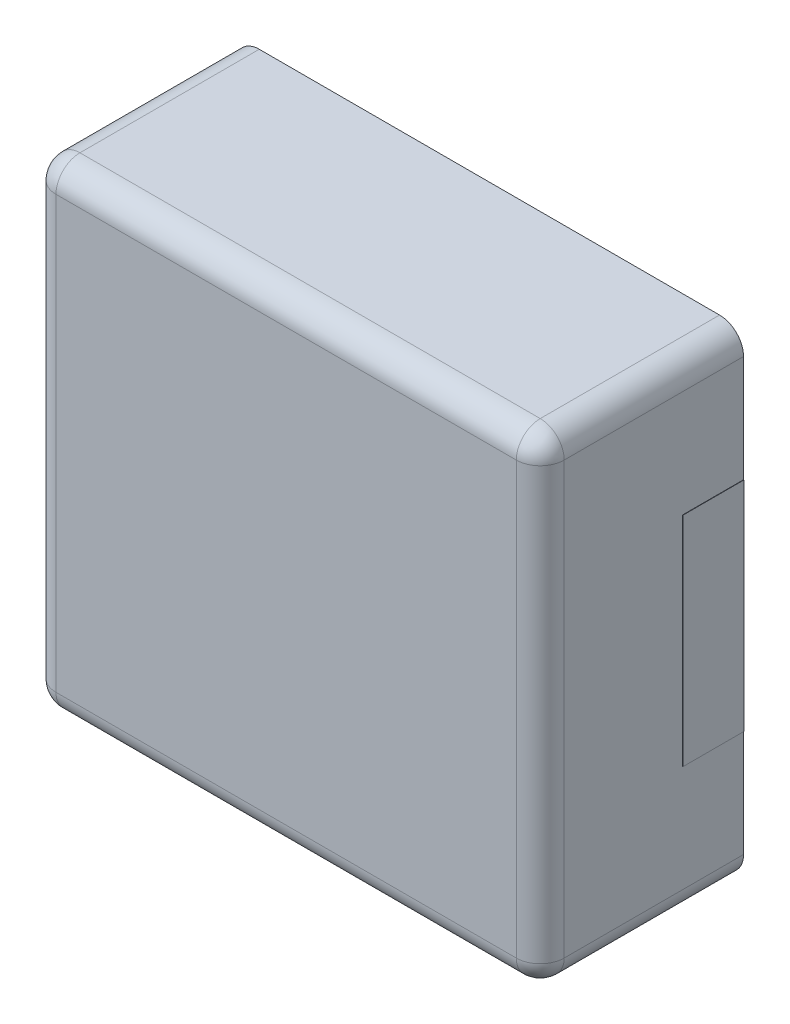
ISO-10303-21;
HEADER;
FILE_DESCRIPTION(('STEP AP214'),'2;1');
FILE_NAME('part.step','',(''),(''),'','','');
FILE_SCHEMA(('AUTOMOTIVE_DESIGN { 1 0 10303 214 1 1 1 1 }'));
ENDSEC;
DATA;
#1=APPLICATION_CONTEXT('core data for automotive mechanical design processes');
#2=APPLICATION_PROTOCOL_DEFINITION('international standard','automotive_design',2000,#1);
#3=PRODUCT_CONTEXT('',#1,'mechanical');
#4=PRODUCT('Part','Part','',(#3));
#5=PRODUCT_RELATED_PRODUCT_CATEGORY('part','',(#4));
#6=PRODUCT_DEFINITION_FORMATION('','',#4);
#7=PRODUCT_DEFINITION_CONTEXT('part definition',#1,'design');
#8=PRODUCT_DEFINITION('design','',#6,#7);
#9=PRODUCT_DEFINITION_SHAPE('','',#8);
#10=(LENGTH_UNIT() NAMED_UNIT(*) SI_UNIT(.MILLI.,.METRE.));
#11=(NAMED_UNIT(*) PLANE_ANGLE_UNIT() SI_UNIT($,.RADIAN.));
#12=(NAMED_UNIT(*) SI_UNIT($,.STERADIAN.) SOLID_ANGLE_UNIT());
#13=UNCERTAINTY_MEASURE_WITH_UNIT(LENGTH_MEASURE(1.E-05),#10,'distance_accuracy_value','');
#14=(GEOMETRIC_REPRESENTATION_CONTEXT(3) GLOBAL_UNCERTAINTY_ASSIGNED_CONTEXT((#13)) GLOBAL_UNIT_ASSIGNED_CONTEXT((#10,
#11,#12)) REPRESENTATION_CONTEXT('',''));
#15=CARTESIAN_POINT('',(0.,0.,0.));
#16=DIRECTION('',(0.,0.,1.));
#17=DIRECTION('',(1.,0.,0.));
#18=AXIS2_PLACEMENT_3D('',#15,#16,#17);
#19=CARTESIAN_POINT('',(3.17,-2.97,2.47));
#20=DIRECTION('',(0.,0.,-1.));
#21=DIRECTION('',(0.,-1.,0.));
#22=AXIS2_PLACEMENT_3D('',#19,#20,#21);
#23=SPHERICAL_SURFACE('',#22,0.33);
#24=CARTESIAN_POINT('',(3.17,-2.97,2.47));
#25=DIRECTION('',(0.,0.,1.));
#26=DIRECTION('',(0.,-1.,0.));
#27=AXIS2_PLACEMENT_3D('',#24,#25,#26);
#28=CIRCLE('',#27,0.33);
#29=CARTESIAN_POINT('',(3.17,-3.3,2.47));
#30=VERTEX_POINT('',#29);
#31=CARTESIAN_POINT('',(3.5,-2.97,2.47));
#32=VERTEX_POINT('',#31);
#33=EDGE_CURVE('P0_E234',#30,#32,#28,.T.);
#34=ORIENTED_EDGE('',*,*,#33,.T.);
#35=CARTESIAN_POINT('',(3.17,-2.97,2.47));
#36=DIRECTION('',(0.,1.,0.));
#37=DIRECTION('',(1.,0.,0.));
#38=AXIS2_PLACEMENT_3D('',#35,#36,#37);
#39=CIRCLE('',#38,0.33);
#40=CARTESIAN_POINT('',(3.17,-2.97,2.8));
#41=VERTEX_POINT('',#40);
#42=EDGE_CURVE('P0_E25',#41,#32,#39,.T.);
#43=ORIENTED_EDGE('',*,*,#42,.F.);
#44=CARTESIAN_POINT('',(3.17,-2.97,2.47));
#45=DIRECTION('',(1.,0.,0.));
#46=DIRECTION('',(0.,0.,1.));
#47=AXIS2_PLACEMENT_3D('',#44,#45,#46);
#48=CIRCLE('',#47,0.33);
#49=EDGE_CURVE('P0_E37',#41,#30,#48,.T.);
#50=ORIENTED_EDGE('',*,*,#49,.T.);
#51=EDGE_LOOP('',(#34,#43,#50));
#52=FACE_BOUND('',#51,.T.);
#53=ADVANCED_FACE('P0_F17',(#52),#23,.T.);
#54=CARTESIAN_POINT('',(1.895,-1.5,0.84));
#55=DIRECTION('',(0.,0.,1.));
#56=DIRECTION('',(1.,0.,0.));
#57=AXIS2_PLACEMENT_3D('',#54,#55,#56);
#58=PLANE('',#57);
#59=DIRECTION('',(0.,-1.,0.));
#60=VECTOR('',#59,1.);
#61=CARTESIAN_POINT('',(3.5,-2.4,0.84));
#62=LINE('',#61,#60);
#63=CARTESIAN_POINT('',(3.5,1.5,0.84));
#64=VERTEX_POINT('',#63);
#65=CARTESIAN_POINT('',(3.5,-1.5,0.84));
#66=VERTEX_POINT('',#65);
#67=EDGE_CURVE('P0_E254',#64,#66,#62,.T.);
#68=ORIENTED_EDGE('',*,*,#67,.T.);
#69=DIRECTION('',(1.,0.,0.));
#70=VECTOR('',#69,1.);
#71=CARTESIAN_POINT('',(1.895,-1.5,0.84));
#72=LINE('',#71,#70);
#73=CARTESIAN_POINT('',(1.895,-1.5,0.84));
#74=VERTEX_POINT('',#73);
#75=EDGE_CURVE('P0_E47',#74,#66,#72,.T.);
#76=ORIENTED_EDGE('',*,*,#75,.F.);
#77=DIRECTION('',(0.,1.,0.));
#78=VECTOR('',#77,1.);
#79=CARTESIAN_POINT('',(1.895,-1.5,0.84));
#80=LINE('',#79,#78);
#81=CARTESIAN_POINT('',(1.895,1.5,0.84));
#82=VERTEX_POINT('',#81);
#83=EDGE_CURVE('P0_E376',#74,#82,#80,.T.);
#84=ORIENTED_EDGE('',*,*,#83,.T.);
#85=DIRECTION('',(1.,0.,0.));
#86=VECTOR('',#85,1.);
#87=CARTESIAN_POINT('',(1.895,1.5,0.84));
#88=LINE('',#87,#86);
#89=EDGE_CURVE('P0_E395',#82,#64,#88,.T.);
#90=ORIENTED_EDGE('',*,*,#89,.T.);
#91=EDGE_LOOP('',(#68,#76,#84,#90));
#92=FACE_BOUND('',#91,.T.);
#93=ADVANCED_FACE('P0_F601',(#92),#58,.F.);
#94=CARTESIAN_POINT('',(3.17,2.97,2.47));
#95=DIRECTION('',(0.,0.,-1.));
#96=DIRECTION('',(1.,0.,0.));
#97=AXIS2_PLACEMENT_3D('',#94,#95,#96);
#98=SPHERICAL_SURFACE('',#97,0.33);
#99=CARTESIAN_POINT('',(3.17,2.97,2.47));
#100=DIRECTION('',(0.,0.,1.));
#101=DIRECTION('',(1.,0.,0.));
#102=AXIS2_PLACEMENT_3D('',#99,#100,#101);
#103=CIRCLE('',#102,0.33);
#104=CARTESIAN_POINT('',(3.5,2.97,2.47));
#105=VERTEX_POINT('',#104);
#106=CARTESIAN_POINT('',(3.17,3.3,2.47));
#107=VERTEX_POINT('',#106);
#108=EDGE_CURVE('P0_E329',#105,#107,#103,.T.);
#109=ORIENTED_EDGE('',*,*,#108,.T.);
#110=CARTESIAN_POINT('',(3.17,2.97,2.47));
#111=DIRECTION('',(-1.,0.,0.));
#112=DIRECTION('',(0.,1.,0.));
#113=AXIS2_PLACEMENT_3D('',#110,#111,#112);
#114=CIRCLE('',#113,0.33);
#115=CARTESIAN_POINT('',(3.17,2.97,2.8));
#116=VERTEX_POINT('',#115);
#117=EDGE_CURVE('P0_E409',#116,#107,#114,.T.);
#118=ORIENTED_EDGE('',*,*,#117,.F.);
#119=CARTESIAN_POINT('',(3.17,2.97,2.47));
#120=DIRECTION('',(0.,1.,0.));
#121=DIRECTION('',(0.,0.,1.));
#122=AXIS2_PLACEMENT_3D('',#119,#120,#121);
#123=CIRCLE('',#122,0.33);
#124=EDGE_CURVE('P0_E11',#116,#105,#123,.T.);
#125=ORIENTED_EDGE('',*,*,#124,.T.);
#126=EDGE_LOOP('',(#109,#118,#125));
#127=FACE_BOUND('',#126,.T.);
#128=ADVANCED_FACE('P0_F617',(#127),#98,.T.);
#129=CARTESIAN_POINT('',(3.17,-2.97,2.47));
#130=DIRECTION('',(0.,1.,0.));
#131=DIRECTION('',(0.,0.,1.));
#132=AXIS2_PLACEMENT_3D('',#129,#130,#131);
#133=CYLINDRICAL_SURFACE('',#132,0.33);
#134=ORIENTED_EDGE('',*,*,#42,.T.);
#135=DIRECTION('',(0.,1.,0.));
#136=VECTOR('',#135,1.);
#137=CARTESIAN_POINT('',(3.5,-2.97,2.47));
#138=LINE('',#137,#136);
#139=EDGE_CURVE('P0_E269',#32,#105,#138,.T.);
#140=ORIENTED_EDGE('',*,*,#139,.T.);
#141=ORIENTED_EDGE('',*,*,#124,.F.);
#142=DIRECTION('',(0.,1.,0.));
#143=VECTOR('',#142,1.);
#144=CARTESIAN_POINT('',(3.17,-2.97,2.8));
#145=LINE('',#144,#143);
#146=EDGE_CURVE('P0_E366',#41,#116,#145,.T.);
#147=ORIENTED_EDGE('',*,*,#146,.F.);
#148=EDGE_LOOP('',(#134,#140,#141,#147));
#149=FACE_BOUND('',#148,.T.);
#150=ADVANCED_FACE('P0_F621',(#149),#133,.T.);
#151=CARTESIAN_POINT('',(-3.17,-2.97,2.47));
#152=DIRECTION('',(1.,0.,0.));
#153=DIRECTION('',(0.,0.,1.));
#154=AXIS2_PLACEMENT_3D('',#151,#152,#153);
#155=CYLINDRICAL_SURFACE('',#154,0.33);
#156=CARTESIAN_POINT('',(-3.17,-2.97,2.47));
#157=DIRECTION('',(1.,0.,0.));
#158=DIRECTION('',(0.,-1.,0.));
#159=AXIS2_PLACEMENT_3D('',#156,#157,#158);
#160=CIRCLE('',#159,0.33);
#161=CARTESIAN_POINT('',(-3.17,-2.97,2.8));
#162=VERTEX_POINT('',#161);
#163=CARTESIAN_POINT('',(-3.17,-3.3,2.47));
#164=VERTEX_POINT('',#163);
#165=EDGE_CURVE('P0_E284',#162,#164,#160,.T.);
#166=ORIENTED_EDGE('',*,*,#165,.T.);
#167=DIRECTION('',(1.,0.,0.));
#168=VECTOR('',#167,1.);
#169=CARTESIAN_POINT('',(-3.17,-3.3,2.47));
#170=LINE('',#169,#168);
#171=EDGE_CURVE('P0_E406',#164,#30,#170,.T.);
#172=ORIENTED_EDGE('',*,*,#171,.T.);
#173=ORIENTED_EDGE('',*,*,#49,.F.);
#174=DIRECTION('',(1.,0.,0.));
#175=VECTOR('',#174,1.);
#176=CARTESIAN_POINT('',(-3.17,-2.97,2.8));
#177=LINE('',#176,#175);
#178=EDGE_CURVE('P0_E362',#162,#41,#177,.T.);
#179=ORIENTED_EDGE('',*,*,#178,.F.);
#180=EDGE_LOOP('',(#166,#172,#173,#179));
#181=FACE_BOUND('',#180,.T.);
#182=ADVANCED_FACE('P0_F666',(#181),#155,.T.);
#183=CARTESIAN_POINT('',(3.17,2.97,2.47));
#184=DIRECTION('',(-1.,0.,0.));
#185=DIRECTION('',(0.,0.,1.));
#186=AXIS2_PLACEMENT_3D('',#183,#184,#185);
#187=CYLINDRICAL_SURFACE('',#186,0.33);
#188=ORIENTED_EDGE('',*,*,#117,.T.);
#189=DIRECTION('',(-1.,0.,0.));
#190=VECTOR('',#189,1.);
#191=CARTESIAN_POINT('',(3.17,3.3,2.47));
#192=LINE('',#191,#190);
#193=CARTESIAN_POINT('',(-3.17,3.3,2.47));
#194=VERTEX_POINT('',#193);
#195=EDGE_CURVE('P0_E280',#107,#194,#192,.T.);
#196=ORIENTED_EDGE('',*,*,#195,.T.);
#197=CARTESIAN_POINT('',(-3.17,2.97,2.47));
#198=DIRECTION('',(-1.,0.,0.));
#199=DIRECTION('',(0.,0.,1.));
#200=AXIS2_PLACEMENT_3D('',#197,#198,#199);
#201=CIRCLE('',#200,0.33);
#202=CARTESIAN_POINT('',(-3.17,2.97,2.8));
#203=VERTEX_POINT('',#202);
#204=EDGE_CURVE('P0_E358',#203,#194,#201,.T.);
#205=ORIENTED_EDGE('',*,*,#204,.F.);
#206=DIRECTION('',(-1.,0.,0.));
#207=VECTOR('',#206,1.);
#208=CARTESIAN_POINT('',(3.17,2.97,2.8));
#209=LINE('',#208,#207);
#210=EDGE_CURVE('P0_E370',#116,#203,#209,.T.);
#211=ORIENTED_EDGE('',*,*,#210,.F.);
#212=EDGE_LOOP('',(#188,#196,#205,#211));
#213=FACE_BOUND('',#212,.T.);
#214=ADVANCED_FACE('P0_F667',(#213),#187,.T.);
#215=CARTESIAN_POINT('',(-3.5,-3.3,0.));
#216=DIRECTION('',(0.,1.,0.));
#217=DIRECTION('',(1.,0.,0.));
#218=AXIS2_PLACEMENT_3D('',#215,#216,#217);
#219=PLANE('',#218);
#220=DIRECTION('',(1.,0.,0.));
#221=VECTOR('',#220,1.);
#222=CARTESIAN_POINT('',(-3.5,-3.3,0.));
#223=LINE('',#222,#221);
#224=CARTESIAN_POINT('',(-3.17,-3.3,0.));
#225=VERTEX_POINT('',#224);
#226=CARTESIAN_POINT('',(3.17,-3.3,0.));
#227=VERTEX_POINT('',#226);
#228=EDGE_CURVE('P0_E324',#225,#227,#223,.T.);
#229=ORIENTED_EDGE('',*,*,#228,.T.);
#230=DIRECTION('',(0.,0.,1.));
#231=VECTOR('',#230,1.);
#232=CARTESIAN_POINT('',(3.17,-3.3,0.));
#233=LINE('',#232,#231);
#234=EDGE_CURVE('P0_E237',#227,#30,#233,.T.);
#235=ORIENTED_EDGE('',*,*,#234,.T.);
#236=ORIENTED_EDGE('',*,*,#171,.F.);
#237=DIRECTION('',(0.,0.,1.));
#238=VECTOR('',#237,1.);
#239=CARTESIAN_POINT('',(-3.17,-3.3,0.));
#240=LINE('',#239,#238);
#241=EDGE_CURVE('P0_E350',#225,#164,#240,.T.);
#242=ORIENTED_EDGE('',*,*,#241,.F.);
#243=EDGE_LOOP('',(#229,#235,#236,#242));
#244=FACE_BOUND('',#243,.T.);
#245=ADVANCED_FACE('P0_F629',(#244),#219,.F.);
#246=CARTESIAN_POINT('',(3.17,-2.97,0.));
#247=DIRECTION('',(0.,0.,1.));
#248=DIRECTION('',(1.,0.,0.));
#249=AXIS2_PLACEMENT_3D('',#246,#247,#248);
#250=CYLINDRICAL_SURFACE('',#249,0.33);
#251=ORIENTED_EDGE('',*,*,#33,.F.);
#252=ORIENTED_EDGE('',*,*,#234,.F.);
#253=CARTESIAN_POINT('',(3.17,-2.97,0.));
#254=DIRECTION('',(0.,0.,-1.));
#255=DIRECTION('',(0.,-1.,0.));
#256=AXIS2_PLACEMENT_3D('',#253,#254,#255);
#257=CIRCLE('',#256,0.33);
#258=CARTESIAN_POINT('',(3.5,-2.97,0.));
#259=VERTEX_POINT('',#258);
#260=EDGE_CURVE('P0_E320',#259,#227,#257,.T.);
#261=ORIENTED_EDGE('',*,*,#260,.F.);
#262=DIRECTION('',(0.,0.,1.));
#263=VECTOR('',#262,1.);
#264=CARTESIAN_POINT('',(3.5,-2.97,0.));
#265=LINE('',#264,#263);
#266=EDGE_CURVE('P0_E265',#259,#32,#265,.T.);
#267=ORIENTED_EDGE('',*,*,#266,.T.);
#268=EDGE_LOOP('',(#251,#252,#261,#267));
#269=FACE_BOUND('',#268,.T.);
#270=ADVANCED_FACE('P0_F625',(#269),#250,.T.);
#271=CARTESIAN_POINT('',(1.895,-1.5,0.));
#272=DIRECTION('',(0.,1.,0.));
#273=DIRECTION('',(1.,0.,0.));
#274=AXIS2_PLACEMENT_3D('',#271,#272,#273);
#275=PLANE('',#274);
#276=DIRECTION('',(1.,0.,0.));
#277=VECTOR('',#276,1.);
#278=CARTESIAN_POINT('',(1.895,-1.5,0.));
#279=LINE('',#278,#277);
#280=CARTESIAN_POINT('',(1.895,-1.5,0.));
#281=VERTEX_POINT('',#280);
#282=CARTESIAN_POINT('',(3.5,-1.5,0.));
#283=VERTEX_POINT('',#282);
#284=EDGE_CURVE('P0_E238',#281,#283,#279,.T.);
#285=ORIENTED_EDGE('',*,*,#284,.F.);
#286=DIRECTION('',(0.,0.,1.));
#287=VECTOR('',#286,1.);
#288=CARTESIAN_POINT('',(1.895,-1.5,0.));
#289=LINE('',#288,#287);
#290=EDGE_CURVE('P0_E379',#281,#74,#289,.T.);
#291=ORIENTED_EDGE('',*,*,#290,.T.);
#292=ORIENTED_EDGE('',*,*,#75,.T.);
#293=DIRECTION('',(0.,0.,1.));
#294=VECTOR('',#293,1.);
#295=CARTESIAN_POINT('',(3.5,-1.5,0.));
#296=LINE('',#295,#294);
#297=EDGE_CURVE('P0_E258',#283,#66,#296,.T.);
#298=ORIENTED_EDGE('',*,*,#297,.F.);
#299=EDGE_LOOP('',(#285,#291,#292,#298));
#300=FACE_BOUND('',#299,.T.);
#301=ADVANCED_FACE('P0_F608',(#300),#275,.T.);
#302=CARTESIAN_POINT('',(1.895,-1.5,0.));
#303=DIRECTION('',(1.,0.,0.));
#304=DIRECTION('',(0.,1.,0.));
#305=AXIS2_PLACEMENT_3D('',#302,#303,#304);
#306=PLANE('',#305);
#307=ORIENTED_EDGE('',*,*,#290,.F.);
#308=DIRECTION('',(0.,1.,0.));
#309=VECTOR('',#308,1.);
#310=CARTESIAN_POINT('',(1.895,-1.5,0.));
#311=LINE('',#310,#309);
#312=CARTESIAN_POINT('',(1.895,1.5,0.));
#313=VERTEX_POINT('',#312);
#314=EDGE_CURVE('P0_E243',#281,#313,#311,.T.);
#315=ORIENTED_EDGE('',*,*,#314,.T.);
#316=DIRECTION('',(0.,0.,1.));
#317=VECTOR('',#316,1.);
#318=CARTESIAN_POINT('',(1.895,1.5,0.));
#319=LINE('',#318,#317);
#320=EDGE_CURVE('P0_E223',#313,#82,#319,.T.);
#321=ORIENTED_EDGE('',*,*,#320,.T.);
#322=ORIENTED_EDGE('',*,*,#83,.F.);
#323=EDGE_LOOP('',(#307,#315,#321,#322));
#324=FACE_BOUND('',#323,.T.);
#325=ADVANCED_FACE('P0_F595',(#324),#306,.T.);
#326=CARTESIAN_POINT('',(1.895,1.5,0.));
#327=DIRECTION('',(0.,1.,0.));
#328=DIRECTION('',(1.,0.,0.));
#329=AXIS2_PLACEMENT_3D('',#326,#327,#328);
#330=PLANE('',#329);
#331=DIRECTION('',(0.,0.,1.));
#332=VECTOR('',#331,1.);
#333=CARTESIAN_POINT('',(3.5,1.5,0.));
#334=LINE('',#333,#332);
#335=CARTESIAN_POINT('',(3.5,1.5,0.));
#336=VERTEX_POINT('',#335);
#337=EDGE_CURVE('P0_E257',#336,#64,#334,.T.);
#338=ORIENTED_EDGE('',*,*,#337,.T.);
#339=ORIENTED_EDGE('',*,*,#89,.F.);
#340=ORIENTED_EDGE('',*,*,#320,.F.);
#341=DIRECTION('',(1.,0.,0.));
#342=VECTOR('',#341,1.);
#343=CARTESIAN_POINT('',(1.895,1.5,0.));
#344=LINE('',#343,#342);
#345=EDGE_CURVE('P0_E305',#313,#336,#344,.T.);
#346=ORIENTED_EDGE('',*,*,#345,.T.);
#347=EDGE_LOOP('',(#338,#339,#340,#346));
#348=FACE_BOUND('',#347,.T.);
#349=ADVANCED_FACE('P0_F599',(#348),#330,.F.);
#350=CARTESIAN_POINT('',(3.5,-3.3,0.));
#351=DIRECTION('',(1.,0.,0.));
#352=DIRECTION('',(0.,1.,0.));
#353=AXIS2_PLACEMENT_3D('',#350,#351,#352);
#354=PLANE('',#353);
#355=ORIENTED_EDGE('',*,*,#139,.F.);
#356=ORIENTED_EDGE('',*,*,#266,.F.);
#357=DIRECTION('',(0.,1.,0.));
#358=VECTOR('',#357,1.);
#359=CARTESIAN_POINT('',(3.5,-3.3,0.));
#360=LINE('',#359,#358);
#361=EDGE_CURVE('P0_E242',#259,#283,#360,.T.);
#362=ORIENTED_EDGE('',*,*,#361,.T.);
#363=ORIENTED_EDGE('',*,*,#297,.T.);
#364=ORIENTED_EDGE('',*,*,#67,.F.);
#365=ORIENTED_EDGE('',*,*,#337,.F.);
#366=DIRECTION('',(0.,1.,0.));
#367=VECTOR('',#366,1.);
#368=CARTESIAN_POINT('',(3.5,-3.3,0.));
#369=LINE('',#368,#367);
#370=CARTESIAN_POINT('',(3.5,2.97,0.));
#371=VERTEX_POINT('',#370);
#372=EDGE_CURVE('P0_E301',#336,#371,#369,.T.);
#373=ORIENTED_EDGE('',*,*,#372,.T.);
#374=DIRECTION('',(0.,0.,1.));
#375=VECTOR('',#374,1.);
#376=CARTESIAN_POINT('',(3.5,2.97,0.));
#377=LINE('',#376,#375);
#378=EDGE_CURVE('P0_E325',#371,#105,#377,.T.);
#379=ORIENTED_EDGE('',*,*,#378,.T.);
#380=EDGE_LOOP('',(#355,#356,#362,#363,#364,#365,#373,#379));
#381=FACE_BOUND('',#380,.T.);
#382=ADVANCED_FACE('P0_F604',(#381),#354,.T.);
#383=CARTESIAN_POINT('',(3.17,2.97,0.));
#384=DIRECTION('',(0.,0.,1.));
#385=DIRECTION('',(1.,0.,0.));
#386=AXIS2_PLACEMENT_3D('',#383,#384,#385);
#387=CYLINDRICAL_SURFACE('',#386,0.33);
#388=ORIENTED_EDGE('',*,*,#378,.F.);
#389=CARTESIAN_POINT('',(3.17,2.97,0.));
#390=DIRECTION('',(0.,0.,1.));
#391=DIRECTION('',(0.,-1.,0.));
#392=AXIS2_PLACEMENT_3D('',#389,#390,#391);
#393=CIRCLE('',#392,0.33);
#394=CARTESIAN_POINT('',(3.17,3.3,0.));
#395=VERTEX_POINT('',#394);
#396=EDGE_CURVE('P0_E297',#371,#395,#393,.T.);
#397=ORIENTED_EDGE('',*,*,#396,.T.);
#398=DIRECTION('',(0.,0.,1.));
#399=VECTOR('',#398,1.);
#400=CARTESIAN_POINT('',(3.17,3.3,0.));
#401=LINE('',#400,#399);
#402=EDGE_CURVE('P0_E283',#395,#107,#401,.T.);
#403=ORIENTED_EDGE('',*,*,#402,.T.);
#404=ORIENTED_EDGE('',*,*,#108,.F.);
#405=EDGE_LOOP('',(#388,#397,#403,#404));
#406=FACE_BOUND('',#405,.T.);
#407=ADVANCED_FACE('P0_F613',(#406),#387,.T.);
#408=CARTESIAN_POINT('',(-1.895,-1.5,0.));
#409=DIRECTION('',(1.,0.,0.));
#410=DIRECTION('',(0.,1.,0.));
#411=AXIS2_PLACEMENT_3D('',#408,#409,#410);
#412=PLANE('',#411);
#413=DIRECTION('',(0.,1.,0.));
#414=VECTOR('',#413,1.);
#415=CARTESIAN_POINT('',(-1.895,-1.5,0.84));
#416=LINE('',#415,#414);
#417=CARTESIAN_POINT('',(-1.895,-1.5,0.84));
#418=VERTEX_POINT('',#417);
#419=CARTESIAN_POINT('',(-1.895,1.5,0.84));
#420=VERTEX_POINT('',#419);
#421=EDGE_CURVE('P0_E306',#418,#420,#416,.T.);
#422=ORIENTED_EDGE('',*,*,#421,.T.);
#423=DIRECTION('',(0.,0.,1.));
#424=VECTOR('',#423,1.);
#425=CARTESIAN_POINT('',(-1.895,1.5,0.));
#426=LINE('',#425,#424);
#427=CARTESIAN_POINT('',(-1.895,1.5,0.));
#428=VERTEX_POINT('',#427);
#429=EDGE_CURVE('P0_E334',#428,#420,#426,.T.);
#430=ORIENTED_EDGE('',*,*,#429,.F.);
#431=DIRECTION('',(0.,1.,0.));
#432=VECTOR('',#431,1.);
#433=CARTESIAN_POINT('',(-1.895,-1.5,0.));
#434=LINE('',#433,#432);
#435=CARTESIAN_POINT('',(-1.895,-1.5,0.));
#436=VERTEX_POINT('',#435);
#437=EDGE_CURVE('P0_E287',#436,#428,#434,.T.);
#438=ORIENTED_EDGE('',*,*,#437,.F.);
#439=DIRECTION('',(0.,0.,1.));
#440=VECTOR('',#439,1.);
#441=CARTESIAN_POINT('',(-1.895,-1.5,0.));
#442=LINE('',#441,#440);
#443=EDGE_CURVE('P0_E347',#436,#418,#442,.T.);
#444=ORIENTED_EDGE('',*,*,#443,.T.);
#445=EDGE_LOOP('',(#422,#430,#438,#444));
#446=FACE_BOUND('',#445,.T.);
#447=ADVANCED_FACE('P0_F639',(#446),#412,.F.);
#448=CARTESIAN_POINT('',(-3.5,3.3,0.));
#449=DIRECTION('',(0.,1.,0.));
#450=DIRECTION('',(1.,0.,0.));
#451=AXIS2_PLACEMENT_3D('',#448,#449,#450);
#452=PLANE('',#451);
#453=DIRECTION('',(0.,0.,1.));
#454=VECTOR('',#453,1.);
#455=CARTESIAN_POINT('',(-3.17,3.3,0.));
#456=LINE('',#455,#454);
#457=CARTESIAN_POINT('',(-3.17,3.3,0.));
#458=VERTEX_POINT('',#457);
#459=EDGE_CURVE('P0_E192',#458,#194,#456,.T.);
#460=ORIENTED_EDGE('',*,*,#459,.T.);
#461=ORIENTED_EDGE('',*,*,#195,.F.);
#462=ORIENTED_EDGE('',*,*,#402,.F.);
#463=DIRECTION('',(1.,0.,0.));
#464=VECTOR('',#463,1.);
#465=CARTESIAN_POINT('',(-3.5,3.3,0.));
#466=LINE('',#465,#464);
#467=EDGE_CURVE('P0_E294',#458,#395,#466,.T.);
#468=ORIENTED_EDGE('',*,*,#467,.F.);
#469=EDGE_LOOP('',(#460,#461,#462,#468));
#470=FACE_BOUND('',#469,.T.);
#471=ADVANCED_FACE('P0_F683',(#470),#452,.T.);
#472=CARTESIAN_POINT('',(-3.17,-2.97,2.47));
#473=DIRECTION('',(0.,0.,-1.));
#474=DIRECTION('',(-1.,0.,0.));
#475=AXIS2_PLACEMENT_3D('',#472,#473,#474);
#476=SPHERICAL_SURFACE('',#475,0.33);
#477=CARTESIAN_POINT('',(-3.17,-2.97,2.47));
#478=DIRECTION('',(0.,0.,1.));
#479=DIRECTION('',(-1.,0.,0.));
#480=AXIS2_PLACEMENT_3D('',#477,#478,#479);
#481=CIRCLE('',#480,0.33);
#482=CARTESIAN_POINT('',(-3.5,-2.97,2.47));
#483=VERTEX_POINT('',#482);
#484=EDGE_CURVE('P0_E354',#483,#164,#481,.T.);
#485=ORIENTED_EDGE('',*,*,#484,.T.);
#486=ORIENTED_EDGE('',*,*,#165,.F.);
#487=CARTESIAN_POINT('',(-3.17,-2.97,2.47));
#488=DIRECTION('',(0.,-1.,0.));
#489=DIRECTION('',(-1.,0.,0.));
#490=AXIS2_PLACEMENT_3D('',#487,#488,#489);
#491=CIRCLE('',#490,0.33);
#492=EDGE_CURVE('P0_E228',#162,#483,#491,.T.);
#493=ORIENTED_EDGE('',*,*,#492,.T.);
#494=EDGE_LOOP('',(#485,#486,#493));
#495=FACE_BOUND('',#494,.T.);
#496=ADVANCED_FACE('P0_F686',(#495),#476,.T.);
#497=CARTESIAN_POINT('',(-3.5,-3.3,2.8));
#498=DIRECTION('',(0.,0.,1.));
#499=DIRECTION('',(1.,0.,0.));
#500=AXIS2_PLACEMENT_3D('',#497,#498,#499);
#501=PLANE('',#500);
#502=ORIENTED_EDGE('',*,*,#178,.T.);
#503=ORIENTED_EDGE('',*,*,#146,.T.);
#504=ORIENTED_EDGE('',*,*,#210,.T.);
#505=DIRECTION('',(0.,-1.,0.));
#506=VECTOR('',#505,1.);
#507=CARTESIAN_POINT('',(-3.17,2.97,2.8));
#508=LINE('',#507,#506);
#509=EDGE_CURVE('P0_E224',#203,#162,#508,.T.);
#510=ORIENTED_EDGE('',*,*,#509,.T.);
#511=EDGE_LOOP('',(#502,#503,#504,#510));
#512=FACE_BOUND('',#511,.T.);
#513=ADVANCED_FACE('P0_F690',(#512),#501,.T.);
#514=CARTESIAN_POINT('',(-3.17,2.97,2.47));
#515=DIRECTION('',(0.,0.,-1.));
#516=DIRECTION('',(0.,1.,0.));
#517=AXIS2_PLACEMENT_3D('',#514,#515,#516);
#518=SPHERICAL_SURFACE('',#517,0.33);
#519=CARTESIAN_POINT('',(-3.17,2.97,2.47));
#520=DIRECTION('',(0.,0.,1.));
#521=DIRECTION('',(0.,1.,0.));
#522=AXIS2_PLACEMENT_3D('',#519,#520,#521);
#523=CIRCLE('',#522,0.33);
#524=CARTESIAN_POINT('',(-3.5,2.97,2.47));
#525=VERTEX_POINT('',#524);
#526=EDGE_CURVE('P0_E227',#194,#525,#523,.T.);
#527=ORIENTED_EDGE('',*,*,#526,.T.);
#528=CARTESIAN_POINT('',(-3.17,2.97,2.47));
#529=DIRECTION('',(0.,-1.,0.));
#530=DIRECTION('',(-1.,0.,0.));
#531=AXIS2_PLACEMENT_3D('',#528,#529,#530);
#532=CIRCLE('',#531,0.33);
#533=EDGE_CURVE('P0_E264',#203,#525,#532,.T.);
#534=ORIENTED_EDGE('',*,*,#533,.F.);
#535=ORIENTED_EDGE('',*,*,#204,.T.);
#536=EDGE_LOOP('',(#527,#534,#535));
#537=FACE_BOUND('',#536,.T.);
#538=ADVANCED_FACE('P0_F694',(#537),#518,.T.);
#539=CARTESIAN_POINT('',(-3.17,-2.97,0.));
#540=DIRECTION('',(0.,0.,1.));
#541=DIRECTION('',(-1.,0.,0.));
#542=AXIS2_PLACEMENT_3D('',#539,#540,#541);
#543=CYLINDRICAL_SURFACE('',#542,0.33);
#544=DIRECTION('',(0.,0.,1.));
#545=VECTOR('',#544,1.);
#546=CARTESIAN_POINT('',(-3.5,-2.97,0.));
#547=LINE('',#546,#545);
#548=CARTESIAN_POINT('',(-3.5,-2.97,0.));
#549=VERTEX_POINT('',#548);
#550=EDGE_CURVE('P0_E230',#549,#483,#547,.T.);
#551=ORIENTED_EDGE('',*,*,#550,.F.);
#552=CARTESIAN_POINT('',(-3.17,-2.97,0.));
#553=DIRECTION('',(0.,0.,1.));
#554=DIRECTION('',(0.,-1.,0.));
#555=AXIS2_PLACEMENT_3D('',#552,#553,#554);
#556=CIRCLE('',#555,0.33);
#557=EDGE_CURVE('P0_E333',#549,#225,#556,.T.);
#558=ORIENTED_EDGE('',*,*,#557,.T.);
#559=ORIENTED_EDGE('',*,*,#241,.T.);
#560=ORIENTED_EDGE('',*,*,#484,.F.);
#561=EDGE_LOOP('',(#551,#558,#559,#560));
#562=FACE_BOUND('',#561,.T.);
#563=ADVANCED_FACE('P0_F631',(#562),#543,.T.);
#564=CARTESIAN_POINT('',(-3.505,-1.5,0.));
#565=DIRECTION('',(0.,1.,0.));
#566=DIRECTION('',(1.,0.,0.));
#567=AXIS2_PLACEMENT_3D('',#564,#565,#566);
#568=PLANE('',#567);
#569=DIRECTION('',(1.,0.,0.));
#570=VECTOR('',#569,1.);
#571=CARTESIAN_POINT('',(-3.505,-1.5,0.));
#572=LINE('',#571,#570);
#573=CARTESIAN_POINT('',(-3.5,-1.5,0.));
#574=VERTEX_POINT('',#573);
#575=EDGE_CURVE('P0_E196',#574,#436,#572,.T.);
#576=ORIENTED_EDGE('',*,*,#575,.F.);
#577=DIRECTION('',(0.,0.,1.));
#578=VECTOR('',#577,1.);
#579=CARTESIAN_POINT('',(-3.5,-1.5,0.));
#580=LINE('',#579,#578);
#581=CARTESIAN_POINT('',(-3.5,-1.5,0.84));
#582=VERTEX_POINT('',#581);
#583=EDGE_CURVE('P0_E250',#574,#582,#580,.T.);
#584=ORIENTED_EDGE('',*,*,#583,.T.);
#585=DIRECTION('',(1.,0.,0.));
#586=VECTOR('',#585,1.);
#587=CARTESIAN_POINT('',(-3.505,-1.5,0.84));
#588=LINE('',#587,#586);
#589=EDGE_CURVE('P0_E309',#582,#418,#588,.T.);
#590=ORIENTED_EDGE('',*,*,#589,.T.);
#591=ORIENTED_EDGE('',*,*,#443,.F.);
#592=EDGE_LOOP('',(#576,#584,#590,#591));
#593=FACE_BOUND('',#592,.T.);
#594=ADVANCED_FACE('P0_F636',(#593),#568,.T.);
#595=CARTESIAN_POINT('',(-3.505,-1.5,0.84));
#596=DIRECTION('',(0.,0.,1.));
#597=DIRECTION('',(1.,0.,0.));
#598=AXIS2_PLACEMENT_3D('',#595,#596,#597);
#599=PLANE('',#598);
#600=ORIENTED_EDGE('',*,*,#421,.F.);
#601=ORIENTED_EDGE('',*,*,#589,.F.);
#602=DIRECTION('',(0.,-1.,0.));
#603=VECTOR('',#602,1.);
#604=CARTESIAN_POINT('',(-3.5,-2.4,0.84));
#605=LINE('',#604,#603);
#606=CARTESIAN_POINT('',(-3.5,1.5,0.84));
#607=VERTEX_POINT('',#606);
#608=EDGE_CURVE('P0_E246',#607,#582,#605,.T.);
#609=ORIENTED_EDGE('',*,*,#608,.F.);
#610=DIRECTION('',(1.,0.,0.));
#611=VECTOR('',#610,1.);
#612=CARTESIAN_POINT('',(-3.505,1.5,0.84));
#613=LINE('',#612,#611);
#614=EDGE_CURVE('P0_E310',#607,#420,#613,.T.);
#615=ORIENTED_EDGE('',*,*,#614,.T.);
#616=EDGE_LOOP('',(#600,#601,#609,#615));
#617=FACE_BOUND('',#616,.T.);
#618=ADVANCED_FACE('P0_F644',(#617),#599,.F.);
#619=CARTESIAN_POINT('',(-3.505,1.5,0.));
#620=DIRECTION('',(0.,1.,0.));
#621=DIRECTION('',(1.,0.,0.));
#622=AXIS2_PLACEMENT_3D('',#619,#620,#621);
#623=PLANE('',#622);
#624=ORIENTED_EDGE('',*,*,#429,.T.);
#625=ORIENTED_EDGE('',*,*,#614,.F.);
#626=DIRECTION('',(0.,0.,1.));
#627=VECTOR('',#626,1.);
#628=CARTESIAN_POINT('',(-3.5,1.5,0.));
#629=LINE('',#628,#627);
#630=CARTESIAN_POINT('',(-3.5,1.5,0.));
#631=VERTEX_POINT('',#630);
#632=EDGE_CURVE('P0_E209',#631,#607,#629,.T.);
#633=ORIENTED_EDGE('',*,*,#632,.F.);
#634=DIRECTION('',(1.,0.,0.));
#635=VECTOR('',#634,1.);
#636=CARTESIAN_POINT('',(-3.505,1.5,0.));
#637=LINE('',#636,#635);
#638=EDGE_CURVE('P0_E204',#631,#428,#637,.T.);
#639=ORIENTED_EDGE('',*,*,#638,.T.);
#640=EDGE_LOOP('',(#624,#625,#633,#639));
#641=FACE_BOUND('',#640,.T.);
#642=ADVANCED_FACE('P0_F641',(#641),#623,.F.);
#643=CARTESIAN_POINT('',(-3.5,-3.3,0.));
#644=DIRECTION('',(0.,0.,1.));
#645=DIRECTION('',(1.,0.,0.));
#646=AXIS2_PLACEMENT_3D('',#643,#644,#645);
#647=PLANE('',#646);
#648=ORIENTED_EDGE('',*,*,#575,.T.);
#649=ORIENTED_EDGE('',*,*,#437,.T.);
#650=ORIENTED_EDGE('',*,*,#638,.F.);
#651=DIRECTION('',(0.,1.,0.));
#652=VECTOR('',#651,1.);
#653=CARTESIAN_POINT('',(-3.5,-3.3,0.));
#654=LINE('',#653,#652);
#655=CARTESIAN_POINT('',(-3.5,2.97,0.));
#656=VERTEX_POINT('',#655);
#657=EDGE_CURVE('P0_E199',#631,#656,#654,.T.);
#658=ORIENTED_EDGE('',*,*,#657,.T.);
#659=CARTESIAN_POINT('',(-3.17,2.97,0.));
#660=DIRECTION('',(0.,0.,-1.));
#661=DIRECTION('',(0.,-1.,0.));
#662=AXIS2_PLACEMENT_3D('',#659,#660,#661);
#663=CIRCLE('',#662,0.33);
#664=EDGE_CURVE('P0_E185',#656,#458,#663,.T.);
#665=ORIENTED_EDGE('',*,*,#664,.T.);
#666=ORIENTED_EDGE('',*,*,#467,.T.);
#667=ORIENTED_EDGE('',*,*,#396,.F.);
#668=ORIENTED_EDGE('',*,*,#372,.F.);
#669=ORIENTED_EDGE('',*,*,#345,.F.);
#670=ORIENTED_EDGE('',*,*,#314,.F.);
#671=ORIENTED_EDGE('',*,*,#284,.T.);
#672=ORIENTED_EDGE('',*,*,#361,.F.);
#673=ORIENTED_EDGE('',*,*,#260,.T.);
#674=ORIENTED_EDGE('',*,*,#228,.F.);
#675=ORIENTED_EDGE('',*,*,#557,.F.);
#676=DIRECTION('',(0.,1.,0.));
#677=VECTOR('',#676,1.);
#678=CARTESIAN_POINT('',(-3.5,-3.3,0.));
#679=LINE('',#678,#677);
#680=EDGE_CURVE('P0_E233',#549,#574,#679,.T.);
#681=ORIENTED_EDGE('',*,*,#680,.T.);
#682=EDGE_LOOP('',(#648,#649,#650,#658,#665,#666,#667,#668,#669,#670,#671,#672,#673,#674,#675,#681));
#683=FACE_BOUND('',#682,.T.);
#684=ADVANCED_FACE('P0_F201',(#683),#647,.F.);
#685=CARTESIAN_POINT('',(-3.17,2.97,0.));
#686=DIRECTION('',(0.,0.,1.));
#687=DIRECTION('',(-1.,0.,0.));
#688=AXIS2_PLACEMENT_3D('',#685,#686,#687);
#689=CYLINDRICAL_SURFACE('',#688,0.33);
#690=ORIENTED_EDGE('',*,*,#526,.F.);
#691=ORIENTED_EDGE('',*,*,#459,.F.);
#692=ORIENTED_EDGE('',*,*,#664,.F.);
#693=DIRECTION('',(0.,0.,1.));
#694=VECTOR('',#693,1.);
#695=CARTESIAN_POINT('',(-3.5,2.97,0.));
#696=LINE('',#695,#694);
#697=EDGE_CURVE('P0_E190',#656,#525,#696,.T.);
#698=ORIENTED_EDGE('',*,*,#697,.T.);
#699=EDGE_LOOP('',(#690,#691,#692,#698));
#700=FACE_BOUND('',#699,.T.);
#701=ADVANCED_FACE('P0_F188',(#700),#689,.T.);
#702=CARTESIAN_POINT('',(-3.17,2.97,2.47));
#703=DIRECTION('',(0.,-1.,0.));
#704=DIRECTION('',(0.,0.,1.));
#705=AXIS2_PLACEMENT_3D('',#702,#703,#704);
#706=CYLINDRICAL_SURFACE('',#705,0.33);
#707=ORIENTED_EDGE('',*,*,#533,.T.);
#708=DIRECTION('',(0.,-1.,0.));
#709=VECTOR('',#708,1.);
#710=CARTESIAN_POINT('',(-3.5,2.97,2.47));
#711=LINE('',#710,#709);
#712=EDGE_CURVE('P0_E215',#525,#483,#711,.T.);
#713=ORIENTED_EDGE('',*,*,#712,.T.);
#714=ORIENTED_EDGE('',*,*,#492,.F.);
#715=ORIENTED_EDGE('',*,*,#509,.F.);
#716=EDGE_LOOP('',(#707,#713,#714,#715));
#717=FACE_BOUND('',#716,.T.);
#718=ADVANCED_FACE('P0_F707',(#717),#706,.T.);
#719=CARTESIAN_POINT('',(-3.5,-3.3,0.));
#720=DIRECTION('',(1.,0.,0.));
#721=DIRECTION('',(0.,1.,0.));
#722=AXIS2_PLACEMENT_3D('',#719,#720,#721);
#723=PLANE('',#722);
#724=ORIENTED_EDGE('',*,*,#697,.F.);
#725=ORIENTED_EDGE('',*,*,#657,.F.);
#726=ORIENTED_EDGE('',*,*,#632,.T.);
#727=ORIENTED_EDGE('',*,*,#608,.T.);
#728=ORIENTED_EDGE('',*,*,#583,.F.);
#729=ORIENTED_EDGE('',*,*,#680,.F.);
#730=ORIENTED_EDGE('',*,*,#550,.T.);
#731=ORIENTED_EDGE('',*,*,#712,.F.);
#732=EDGE_LOOP('',(#724,#725,#726,#727,#728,#729,#730,#731));
#733=FACE_BOUND('',#732,.T.);
#734=ADVANCED_FACE('P0_F212',(#733),#723,.F.);
#735=CLOSED_SHELL('',(#53,#93,#128,#150,#182,#214,#245,#270,#301,#325,#349,#382,#407,#447,#471,
#496,#513,#538,#563,#594,#618,#642,#684,#701,#718,#734));
#736=MANIFOLD_SOLID_BREP('P0_B1',#735);
#737=CARTESIAN_POINT('',(-3.505,-1.5,0.84));
#738=DIRECTION('',(0.,0.,1.));
#739=DIRECTION('',(1.,0.,0.));
#740=AXIS2_PLACEMENT_3D('',#737,#738,#739);
#741=PLANE('',#740);
#742=DIRECTION('',(0.,1.,0.));
#743=VECTOR('',#742,1.);
#744=CARTESIAN_POINT('',(-3.505,-1.5,0.84));
#745=LINE('',#744,#743);
#746=CARTESIAN_POINT('',(-3.505,-1.5,0.84));
#747=VERTEX_POINT('',#746);
#748=CARTESIAN_POINT('',(-3.505,1.5,0.84));
#749=VERTEX_POINT('',#748);
#750=EDGE_CURVE('P1_E89',#747,#749,#745,.T.);
#751=ORIENTED_EDGE('',*,*,#750,.F.);
#752=DIRECTION('',(1.,0.,0.));
#753=VECTOR('',#752,1.);
#754=CARTESIAN_POINT('',(-3.505,-1.5,0.84));
#755=LINE('',#754,#753);
#756=CARTESIAN_POINT('',(-1.895,-1.5,0.84));
#757=VERTEX_POINT('',#756);
#758=EDGE_CURVE('P1_E71',#747,#757,#755,.T.);
#759=ORIENTED_EDGE('',*,*,#758,.T.);
#760=DIRECTION('',(0.,1.,0.));
#761=VECTOR('',#760,1.);
#762=CARTESIAN_POINT('',(-1.895,-1.5,0.84));
#763=LINE('',#762,#761);
#764=CARTESIAN_POINT('',(-1.895,1.5,0.84));
#765=VERTEX_POINT('',#764);
#766=EDGE_CURVE('P1_E83',#757,#765,#763,.T.);
#767=ORIENTED_EDGE('',*,*,#766,.T.);
#768=DIRECTION('',(1.,0.,0.));
#769=VECTOR('',#768,1.);
#770=CARTESIAN_POINT('',(-3.505,1.5,0.84));
#771=LINE('',#770,#769);
#772=EDGE_CURVE('P1_E11',#749,#765,#771,.T.);
#773=ORIENTED_EDGE('',*,*,#772,.F.);
#774=EDGE_LOOP('',(#751,#759,#767,#773));
#775=FACE_BOUND('',#774,.T.);
#776=ADVANCED_FACE('P1_F17',(#775),#741,.T.);
#777=CARTESIAN_POINT('',(-3.505,-1.5,0.));
#778=DIRECTION('',(0.,0.,1.));
#779=DIRECTION('',(1.,0.,0.));
#780=AXIS2_PLACEMENT_3D('',#777,#778,#779);
#781=PLANE('',#780);
#782=DIRECTION('',(1.,0.,0.));
#783=VECTOR('',#782,1.);
#784=CARTESIAN_POINT('',(-3.505,1.5,0.));
#785=LINE('',#784,#783);
#786=CARTESIAN_POINT('',(-3.505,1.5,0.));
#787=VERTEX_POINT('',#786);
#788=CARTESIAN_POINT('',(-1.895,1.5,0.));
#789=VERTEX_POINT('',#788);
#790=EDGE_CURVE('P1_E20',#787,#789,#785,.T.);
#791=ORIENTED_EDGE('',*,*,#790,.T.);
#792=DIRECTION('',(0.,1.,0.));
#793=VECTOR('',#792,1.);
#794=CARTESIAN_POINT('',(-1.895,-1.5,0.));
#795=LINE('',#794,#793);
#796=CARTESIAN_POINT('',(-1.895,-1.5,0.));
#797=VERTEX_POINT('',#796);
#798=EDGE_CURVE('P1_E103',#797,#789,#795,.T.);
#799=ORIENTED_EDGE('',*,*,#798,.F.);
#800=DIRECTION('',(1.,0.,0.));
#801=VECTOR('',#800,1.);
#802=CARTESIAN_POINT('',(-3.505,-1.5,0.));
#803=LINE('',#802,#801);
#804=CARTESIAN_POINT('',(-3.505,-1.5,0.));
#805=VERTEX_POINT('',#804);
#806=EDGE_CURVE('P1_E82',#805,#797,#803,.T.);
#807=ORIENTED_EDGE('',*,*,#806,.F.);
#808=DIRECTION('',(0.,1.,0.));
#809=VECTOR('',#808,1.);
#810=CARTESIAN_POINT('',(-3.505,-1.5,0.));
#811=LINE('',#810,#809);
#812=EDGE_CURVE('P1_E90',#805,#787,#811,.T.);
#813=ORIENTED_EDGE('',*,*,#812,.T.);
#814=EDGE_LOOP('',(#791,#799,#807,#813));
#815=FACE_BOUND('',#814,.T.);
#816=ADVANCED_FACE('P1_F125',(#815),#781,.F.);
#817=CARTESIAN_POINT('',(-3.505,1.5,0.));
#818=DIRECTION('',(0.,1.,0.));
#819=DIRECTION('',(1.,0.,0.));
#820=AXIS2_PLACEMENT_3D('',#817,#818,#819);
#821=PLANE('',#820);
#822=ORIENTED_EDGE('',*,*,#790,.F.);
#823=DIRECTION('',(0.,0.,1.));
#824=VECTOR('',#823,1.);
#825=CARTESIAN_POINT('',(-3.505,1.5,0.));
#826=LINE('',#825,#824);
#827=EDGE_CURVE('P1_E94',#787,#749,#826,.T.);
#828=ORIENTED_EDGE('',*,*,#827,.T.);
#829=ORIENTED_EDGE('',*,*,#772,.T.);
#830=DIRECTION('',(0.,0.,1.));
#831=VECTOR('',#830,1.);
#832=CARTESIAN_POINT('',(-1.895,1.5,0.));
#833=LINE('',#832,#831);
#834=EDGE_CURVE('P1_E101',#789,#765,#833,.T.);
#835=ORIENTED_EDGE('',*,*,#834,.F.);
#836=EDGE_LOOP('',(#822,#828,#829,#835));
#837=FACE_BOUND('',#836,.T.);
#838=ADVANCED_FACE('P1_F120',(#837),#821,.T.);
#839=CARTESIAN_POINT('',(-3.505,-1.5,0.));
#840=DIRECTION('',(0.,1.,0.));
#841=DIRECTION('',(1.,0.,0.));
#842=AXIS2_PLACEMENT_3D('',#839,#840,#841);
#843=PLANE('',#842);
#844=DIRECTION('',(0.,0.,1.));
#845=VECTOR('',#844,1.);
#846=CARTESIAN_POINT('',(-1.895,-1.5,0.));
#847=LINE('',#846,#845);
#848=EDGE_CURVE('P1_E77',#797,#757,#847,.T.);
#849=ORIENTED_EDGE('',*,*,#848,.T.);
#850=ORIENTED_EDGE('',*,*,#758,.F.);
#851=DIRECTION('',(0.,0.,1.));
#852=VECTOR('',#851,1.);
#853=CARTESIAN_POINT('',(-3.505,-1.5,0.));
#854=LINE('',#853,#852);
#855=EDGE_CURVE('P1_E74',#805,#747,#854,.T.);
#856=ORIENTED_EDGE('',*,*,#855,.F.);
#857=ORIENTED_EDGE('',*,*,#806,.T.);
#858=EDGE_LOOP('',(#849,#850,#856,#857));
#859=FACE_BOUND('',#858,.T.);
#860=ADVANCED_FACE('P1_F73',(#859),#843,.F.);
#861=CARTESIAN_POINT('',(-1.895,-1.5,0.));
#862=DIRECTION('',(1.,0.,0.));
#863=DIRECTION('',(0.,1.,0.));
#864=AXIS2_PLACEMENT_3D('',#861,#862,#863);
#865=PLANE('',#864);
#866=ORIENTED_EDGE('',*,*,#848,.F.);
#867=ORIENTED_EDGE('',*,*,#798,.T.);
#868=ORIENTED_EDGE('',*,*,#834,.T.);
#869=ORIENTED_EDGE('',*,*,#766,.F.);
#870=EDGE_LOOP('',(#866,#867,#868,#869));
#871=FACE_BOUND('',#870,.T.);
#872=ADVANCED_FACE('P1_F136',(#871),#865,.T.);
#873=CARTESIAN_POINT('',(-3.505,-1.5,0.));
#874=DIRECTION('',(1.,0.,0.));
#875=DIRECTION('',(0.,1.,0.));
#876=AXIS2_PLACEMENT_3D('',#873,#874,#875);
#877=PLANE('',#876);
#878=ORIENTED_EDGE('',*,*,#750,.T.);
#879=ORIENTED_EDGE('',*,*,#827,.F.);
#880=ORIENTED_EDGE('',*,*,#812,.F.);
#881=ORIENTED_EDGE('',*,*,#855,.T.);
#882=EDGE_LOOP('',(#878,#879,#880,#881));
#883=FACE_BOUND('',#882,.T.);
#884=ADVANCED_FACE('P1_F87',(#883),#877,.F.);
#885=CLOSED_SHELL('',(#776,#816,#838,#860,#872,#884));
#886=MANIFOLD_SOLID_BREP('P1_B1',#885);
#887=CARTESIAN_POINT('',(1.895,-1.5,0.84));
#888=DIRECTION('',(0.,0.,1.));
#889=DIRECTION('',(1.,0.,0.));
#890=AXIS2_PLACEMENT_3D('',#887,#888,#889);
#891=PLANE('',#890);
#892=DIRECTION('',(0.,1.,0.));
#893=VECTOR('',#892,1.);
#894=CARTESIAN_POINT('',(1.895,-1.5,0.84));
#895=LINE('',#894,#893);
#896=CARTESIAN_POINT('',(1.895,-1.5,0.84));
#897=VERTEX_POINT('',#896);
#898=CARTESIAN_POINT('',(1.895,1.5,0.84));
#899=VERTEX_POINT('',#898);
#900=EDGE_CURVE('P2_E155',#897,#899,#895,.T.);
#901=ORIENTED_EDGE('',*,*,#900,.F.);
#902=DIRECTION('',(1.,0.,0.));
#903=VECTOR('',#902,1.);
#904=CARTESIAN_POINT('',(1.895,-1.5,0.84));
#905=LINE('',#904,#903);
#906=CARTESIAN_POINT('',(3.505,-1.5,0.84));
#907=VERTEX_POINT('',#906);
#908=EDGE_CURVE('P2_E73',#897,#907,#905,.T.);
#909=ORIENTED_EDGE('',*,*,#908,.T.);
#910=DIRECTION('',(0.,1.,0.));
#911=VECTOR('',#910,1.);
#912=CARTESIAN_POINT('',(3.505,-1.5,0.84));
#913=LINE('',#912,#911);
#914=CARTESIAN_POINT('',(3.505,1.5,0.84));
#915=VERTEX_POINT('',#914);
#916=EDGE_CURVE('P2_E85',#907,#915,#913,.T.);
#917=ORIENTED_EDGE('',*,*,#916,.T.);
#918=DIRECTION('',(1.,0.,0.));
#919=VECTOR('',#918,1.);
#920=CARTESIAN_POINT('',(1.895,1.5,0.84));
#921=LINE('',#920,#919);
#922=EDGE_CURVE('P2_E11',#899,#915,#921,.T.);
#923=ORIENTED_EDGE('',*,*,#922,.F.);
#924=EDGE_LOOP('',(#901,#909,#917,#923));
#925=FACE_BOUND('',#924,.T.);
#926=ADVANCED_FACE('P2_F17',(#925),#891,.T.);
#927=CARTESIAN_POINT('',(1.895,-1.5,0.));
#928=DIRECTION('',(0.,0.,1.));
#929=DIRECTION('',(1.,0.,0.));
#930=AXIS2_PLACEMENT_3D('',#927,#928,#929);
#931=PLANE('',#930);
#932=DIRECTION('',(1.,0.,0.));
#933=VECTOR('',#932,1.);
#934=CARTESIAN_POINT('',(1.895,1.5,0.));
#935=LINE('',#934,#933);
#936=CARTESIAN_POINT('',(1.895,1.5,0.));
#937=VERTEX_POINT('',#936);
#938=CARTESIAN_POINT('',(3.505,1.5,0.));
#939=VERTEX_POINT('',#938);
#940=EDGE_CURVE('P2_E25',#937,#939,#935,.T.);
#941=ORIENTED_EDGE('',*,*,#940,.T.);
#942=DIRECTION('',(0.,1.,0.));
#943=VECTOR('',#942,1.);
#944=CARTESIAN_POINT('',(3.505,-1.5,0.));
#945=LINE('',#944,#943);
#946=CARTESIAN_POINT('',(3.505,-1.5,0.));
#947=VERTEX_POINT('',#946);
#948=EDGE_CURVE('P2_E76',#947,#939,#945,.T.);
#949=ORIENTED_EDGE('',*,*,#948,.F.);
#950=DIRECTION('',(1.,0.,0.));
#951=VECTOR('',#950,1.);
#952=CARTESIAN_POINT('',(1.895,-1.5,0.));
#953=LINE('',#952,#951);
#954=CARTESIAN_POINT('',(1.895,-1.5,0.));
#955=VERTEX_POINT('',#954);
#956=EDGE_CURVE('P2_E64',#955,#947,#953,.T.);
#957=ORIENTED_EDGE('',*,*,#956,.F.);
#958=DIRECTION('',(0.,1.,0.));
#959=VECTOR('',#958,1.);
#960=CARTESIAN_POINT('',(1.895,-1.5,0.));
#961=LINE('',#960,#959);
#962=EDGE_CURVE('P2_E90',#955,#937,#961,.T.);
#963=ORIENTED_EDGE('',*,*,#962,.T.);
#964=EDGE_LOOP('',(#941,#949,#957,#963));
#965=FACE_BOUND('',#964,.T.);
#966=ADVANCED_FACE('P2_F77',(#965),#931,.F.);
#967=CARTESIAN_POINT('',(1.895,1.5,0.));
#968=DIRECTION('',(0.,1.,0.));
#969=DIRECTION('',(1.,0.,0.));
#970=AXIS2_PLACEMENT_3D('',#967,#968,#969);
#971=PLANE('',#970);
#972=ORIENTED_EDGE('',*,*,#940,.F.);
#973=DIRECTION('',(0.,0.,1.));
#974=VECTOR('',#973,1.);
#975=CARTESIAN_POINT('',(1.895,1.5,0.));
#976=LINE('',#975,#974);
#977=EDGE_CURVE('P2_E157',#937,#899,#976,.T.);
#978=ORIENTED_EDGE('',*,*,#977,.T.);
#979=ORIENTED_EDGE('',*,*,#922,.T.);
#980=DIRECTION('',(0.,0.,1.));
#981=VECTOR('',#980,1.);
#982=CARTESIAN_POINT('',(3.505,1.5,0.));
#983=LINE('',#982,#981);
#984=EDGE_CURVE('P2_E81',#939,#915,#983,.T.);
#985=ORIENTED_EDGE('',*,*,#984,.F.);
#986=EDGE_LOOP('',(#972,#978,#979,#985));
#987=FACE_BOUND('',#986,.T.);
#988=ADVANCED_FACE('P2_F123',(#987),#971,.T.);
#989=CARTESIAN_POINT('',(1.895,-1.5,0.));
#990=DIRECTION('',(0.,1.,0.));
#991=DIRECTION('',(1.,0.,0.));
#992=AXIS2_PLACEMENT_3D('',#989,#990,#991);
#993=PLANE('',#992);
#994=DIRECTION('',(0.,0.,1.));
#995=VECTOR('',#994,1.);
#996=CARTESIAN_POINT('',(3.505,-1.5,0.));
#997=LINE('',#996,#995);
#998=EDGE_CURVE('P2_E68',#947,#907,#997,.T.);
#999=ORIENTED_EDGE('',*,*,#998,.T.);
#1000=ORIENTED_EDGE('',*,*,#908,.F.);
#1001=DIRECTION('',(0.,0.,1.));
#1002=VECTOR('',#1001,1.);
#1003=CARTESIAN_POINT('',(1.895,-1.5,0.));
#1004=LINE('',#1003,#1002);
#1005=EDGE_CURVE('P2_E70',#955,#897,#1004,.T.);
#1006=ORIENTED_EDGE('',*,*,#1005,.F.);
#1007=ORIENTED_EDGE('',*,*,#956,.T.);
#1008=EDGE_LOOP('',(#999,#1000,#1006,#1007));
#1009=FACE_BOUND('',#1008,.T.);
#1010=ADVANCED_FACE('P2_F65',(#1009),#993,.F.);
#1011=CARTESIAN_POINT('',(3.505,-1.5,0.));
#1012=DIRECTION('',(1.,0.,0.));
#1013=DIRECTION('',(0.,1.,0.));
#1014=AXIS2_PLACEMENT_3D('',#1011,#1012,#1013);
#1015=PLANE('',#1014);
#1016=ORIENTED_EDGE('',*,*,#998,.F.);
#1017=ORIENTED_EDGE('',*,*,#948,.T.);
#1018=ORIENTED_EDGE('',*,*,#984,.T.);
#1019=ORIENTED_EDGE('',*,*,#916,.F.);
#1020=EDGE_LOOP('',(#1016,#1017,#1018,#1019));
#1021=FACE_BOUND('',#1020,.T.);
#1022=ADVANCED_FACE('P2_F84',(#1021),#1015,.T.);
#1023=CARTESIAN_POINT('',(1.895,-1.5,0.));
#1024=DIRECTION('',(1.,0.,0.));
#1025=DIRECTION('',(0.,1.,0.));
#1026=AXIS2_PLACEMENT_3D('',#1023,#1024,#1025);
#1027=PLANE('',#1026);
#1028=ORIENTED_EDGE('',*,*,#900,.T.);
#1029=ORIENTED_EDGE('',*,*,#977,.F.);
#1030=ORIENTED_EDGE('',*,*,#962,.F.);
#1031=ORIENTED_EDGE('',*,*,#1005,.T.);
#1032=EDGE_LOOP('',(#1028,#1029,#1030,#1031));
#1033=FACE_BOUND('',#1032,.T.);
#1034=ADVANCED_FACE('P2_F102',(#1033),#1027,.F.);
#1035=CLOSED_SHELL('',(#926,#966,#988,#1010,#1022,#1034));
#1036=MANIFOLD_SOLID_BREP('P2_B1',#1035);
#1037=ADVANCED_BREP_SHAPE_REPRESENTATION('',(#18,#736,#886,#1036),#14);
#1038=SHAPE_DEFINITION_REPRESENTATION(#9,#1037);
ENDSEC;
END-ISO-10303-21;
